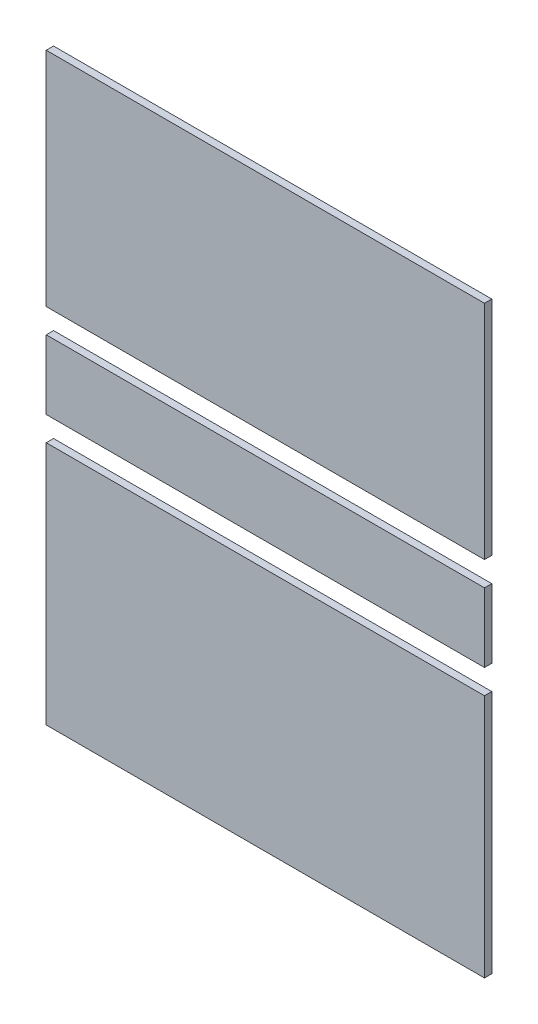
ISO-10303-21;
HEADER;
FILE_DESCRIPTION(('STEP AP214'),'2;1');
FILE_NAME('part.step','',(''),(''),'','','');
FILE_SCHEMA(('AUTOMOTIVE_DESIGN { 1 0 10303 214 1 1 1 1 }'));
ENDSEC;
DATA;
#1=APPLICATION_CONTEXT('core data for automotive mechanical design processes');
#2=APPLICATION_PROTOCOL_DEFINITION('international standard','automotive_design',2000,#1);
#3=PRODUCT_CONTEXT('',#1,'mechanical');
#4=PRODUCT('Part','Part','',(#3));
#5=PRODUCT_RELATED_PRODUCT_CATEGORY('part','',(#4));
#6=PRODUCT_DEFINITION_FORMATION('','',#4);
#7=PRODUCT_DEFINITION_CONTEXT('part definition',#1,'design');
#8=PRODUCT_DEFINITION('design','',#6,#7);
#9=PRODUCT_DEFINITION_SHAPE('','',#8);
#10=(LENGTH_UNIT() NAMED_UNIT(*) SI_UNIT(.MILLI.,.METRE.));
#11=(NAMED_UNIT(*) PLANE_ANGLE_UNIT() SI_UNIT($,.RADIAN.));
#12=(NAMED_UNIT(*) SI_UNIT($,.STERADIAN.) SOLID_ANGLE_UNIT());
#13=UNCERTAINTY_MEASURE_WITH_UNIT(LENGTH_MEASURE(1.E-05),#10,'distance_accuracy_value','');
#14=(GEOMETRIC_REPRESENTATION_CONTEXT(3) GLOBAL_UNCERTAINTY_ASSIGNED_CONTEXT((#13)) GLOBAL_UNIT_ASSIGNED_CONTEXT((#10,
#11,#12)) REPRESENTATION_CONTEXT('',''));
#15=CARTESIAN_POINT('',(0.,0.,0.));
#16=DIRECTION('',(0.,0.,1.));
#17=DIRECTION('',(1.,0.,0.));
#18=AXIS2_PLACEMENT_3D('',#15,#16,#17);
#19=CARTESIAN_POINT('',(0.,235.,-308.556380585461));
#20=DIRECTION('',(-1.,0.,0.));
#21=DIRECTION('',(0.,-1.,0.));
#22=AXIS2_PLACEMENT_3D('',#19,#20,#21);
#23=PLANE('',#22);
#24=DIRECTION('',(0.,1.,0.));
#25=VECTOR('',#24,1.);
#26=CARTESIAN_POINT('',(0.,235.,0.));
#27=LINE('',#26,#25);
#28=CARTESIAN_POINT('',(0.,187.,0.));
#29=VERTEX_POINT('',#28);
#30=CARTESIAN_POINT('',(0.,235.,0.));
#31=VERTEX_POINT('',#30);
#32=EDGE_CURVE('E66',#29,#31,#27,.T.);
#33=ORIENTED_EDGE('',*,*,#32,.F.);
#34=DIRECTION('',(0.,0.,1.));
#35=VECTOR('',#34,1.);
#36=CARTESIAN_POINT('',(0.,187.,-308.556380585461));
#37=LINE('',#36,#35);
#38=CARTESIAN_POINT('',(0.,187.,5.08));
#39=VERTEX_POINT('',#38);
#40=EDGE_CURVE('E94',#29,#39,#37,.T.);
#41=ORIENTED_EDGE('',*,*,#40,.T.);
#42=DIRECTION('',(0.,-1.,0.));
#43=VECTOR('',#42,1.);
#44=CARTESIAN_POINT('',(0.,235.,5.08));
#45=LINE('',#44,#43);
#46=CARTESIAN_POINT('',(0.,235.,5.08));
#47=VERTEX_POINT('',#46);
#48=EDGE_CURVE('E98',#47,#39,#45,.T.);
#49=ORIENTED_EDGE('',*,*,#48,.F.);
#50=DIRECTION('',(0.,0.,1.));
#51=VECTOR('',#50,1.);
#52=CARTESIAN_POINT('',(0.,235.,-308.556380585461));
#53=LINE('',#52,#51);
#54=EDGE_CURVE('E121',#31,#47,#53,.T.);
#55=ORIENTED_EDGE('',*,*,#54,.F.);
#56=EDGE_LOOP('',(#33,#41,#49,#55));
#57=FACE_BOUND('',#56,.T.);
#58=ADVANCED_FACE('F58',(#57),#23,.T.);
#59=CARTESIAN_POINT('',(0.,235.,-308.556380585461));
#60=DIRECTION('',(0.,1.,0.));
#61=DIRECTION('',(0.,0.,1.));
#62=AXIS2_PLACEMENT_3D('',#59,#60,#61);
#63=PLANE('',#62);
#64=DIRECTION('',(1.,0.,0.));
#65=VECTOR('',#64,1.);
#66=CARTESIAN_POINT('',(0.,235.,0.));
#67=LINE('',#66,#65);
#68=CARTESIAN_POINT('',(304.8,235.,0.));
#69=VERTEX_POINT('',#68);
#70=EDGE_CURVE('E72',#31,#69,#67,.T.);
#71=ORIENTED_EDGE('',*,*,#70,.F.);
#72=ORIENTED_EDGE('',*,*,#54,.T.);
#73=DIRECTION('',(-1.,0.,0.));
#74=VECTOR('',#73,1.);
#75=CARTESIAN_POINT('',(0.,235.,5.08));
#76=LINE('',#75,#74);
#77=CARTESIAN_POINT('',(304.8,235.,5.08));
#78=VERTEX_POINT('',#77);
#79=EDGE_CURVE('E103',#78,#47,#76,.T.);
#80=ORIENTED_EDGE('',*,*,#79,.F.);
#81=DIRECTION('',(0.,0.,1.));
#82=VECTOR('',#81,1.);
#83=CARTESIAN_POINT('',(304.8,235.,-308.556380585461));
#84=LINE('',#83,#82);
#85=EDGE_CURVE('E124',#69,#78,#84,.T.);
#86=ORIENTED_EDGE('',*,*,#85,.F.);
#87=EDGE_LOOP('',(#71,#72,#80,#86));
#88=FACE_BOUND('',#87,.T.);
#89=ADVANCED_FACE('F130',(#88),#63,.T.);
#90=CARTESIAN_POINT('',(304.8,235.,-308.556380585461));
#91=DIRECTION('',(1.,0.,0.));
#92=DIRECTION('',(0.,0.,-1.));
#93=AXIS2_PLACEMENT_3D('',#90,#91,#92);
#94=PLANE('',#93);
#95=DIRECTION('',(0.,-1.,0.));
#96=VECTOR('',#95,1.);
#97=CARTESIAN_POINT('',(304.8,235.,0.));
#98=LINE('',#97,#96);
#99=CARTESIAN_POINT('',(304.8,187.,0.));
#100=VERTEX_POINT('',#99);
#101=EDGE_CURVE('E123',#69,#100,#98,.T.);
#102=ORIENTED_EDGE('',*,*,#101,.F.);
#103=ORIENTED_EDGE('',*,*,#85,.T.);
#104=DIRECTION('',(0.,1.,0.));
#105=VECTOR('',#104,1.);
#106=CARTESIAN_POINT('',(304.8,235.,5.08));
#107=LINE('',#106,#105);
#108=CARTESIAN_POINT('',(304.8,187.,5.08));
#109=VERTEX_POINT('',#108);
#110=EDGE_CURVE('E111',#109,#78,#107,.T.);
#111=ORIENTED_EDGE('',*,*,#110,.F.);
#112=DIRECTION('',(0.,0.,1.));
#113=VECTOR('',#112,1.);
#114=CARTESIAN_POINT('',(304.8,187.,-308.556380585461));
#115=LINE('',#114,#113);
#116=EDGE_CURVE('E102',#100,#109,#115,.T.);
#117=ORIENTED_EDGE('',*,*,#116,.F.);
#118=EDGE_LOOP('',(#102,#103,#111,#117));
#119=FACE_BOUND('',#118,.T.);
#120=ADVANCED_FACE('F128',(#119),#94,.T.);
#121=CARTESIAN_POINT('',(0.,187.,-308.556380585461));
#122=DIRECTION('',(0.,-1.,0.));
#123=DIRECTION('',(0.,0.,-1.));
#124=AXIS2_PLACEMENT_3D('',#121,#122,#123);
#125=PLANE('',#124);
#126=DIRECTION('',(-1.,0.,0.));
#127=VECTOR('',#126,1.);
#128=CARTESIAN_POINT('',(0.,187.,0.));
#129=LINE('',#128,#127);
#130=EDGE_CURVE('E12',#100,#29,#129,.T.);
#131=ORIENTED_EDGE('',*,*,#130,.F.);
#132=ORIENTED_EDGE('',*,*,#116,.T.);
#133=DIRECTION('',(1.,0.,0.));
#134=VECTOR('',#133,1.);
#135=CARTESIAN_POINT('',(0.,187.,5.08));
#136=LINE('',#135,#134);
#137=EDGE_CURVE('E105',#39,#109,#136,.T.);
#138=ORIENTED_EDGE('',*,*,#137,.F.);
#139=ORIENTED_EDGE('',*,*,#40,.F.);
#140=EDGE_LOOP('',(#131,#132,#138,#139));
#141=FACE_BOUND('',#140,.T.);
#142=ADVANCED_FACE('F106',(#141),#125,.T.);
#143=CARTESIAN_POINT('',(0.,0.,5.08));
#144=DIRECTION('',(0.,0.,1.));
#145=DIRECTION('',(1.,0.,0.));
#146=AXIS2_PLACEMENT_3D('',#143,#144,#145);
#147=PLANE('',#146);
#148=ORIENTED_EDGE('',*,*,#48,.T.);
#149=ORIENTED_EDGE('',*,*,#137,.T.);
#150=ORIENTED_EDGE('',*,*,#110,.T.);
#151=ORIENTED_EDGE('',*,*,#79,.T.);
#152=EDGE_LOOP('',(#148,#149,#150,#151));
#153=FACE_BOUND('',#152,.T.);
#154=ADVANCED_FACE('F113',(#153),#147,.T.);
#155=CARTESIAN_POINT('',(0.,0.,0.));
#156=DIRECTION('',(0.,0.,1.));
#157=DIRECTION('',(1.,0.,0.));
#158=AXIS2_PLACEMENT_3D('',#155,#156,#157);
#159=PLANE('',#158);
#160=ORIENTED_EDGE('',*,*,#32,.T.);
#161=ORIENTED_EDGE('',*,*,#70,.T.);
#162=ORIENTED_EDGE('',*,*,#101,.T.);
#163=ORIENTED_EDGE('',*,*,#130,.T.);
#164=EDGE_LOOP('',(#160,#161,#162,#163));
#165=FACE_BOUND('',#164,.T.);
#166=ADVANCED_FACE('F132',(#165),#159,.F.);
#167=CLOSED_SHELL('',(#58,#89,#120,#142,#154,#166));
#168=MANIFOLD_SOLID_BREP('B2',#167);
#169=CARTESIAN_POINT('',(0.,170.,5.08));
#170=DIRECTION('',(0.,1.,0.));
#171=DIRECTION('',(0.,0.,1.));
#172=AXIS2_PLACEMENT_3D('',#169,#170,#171);
#173=PLANE('',#172);
#174=DIRECTION('',(1.,0.,0.));
#175=VECTOR('',#174,1.);
#176=CARTESIAN_POINT('',(0.,170.,0.));
#177=LINE('',#176,#175);
#178=CARTESIAN_POINT('',(0.,170.,0.));
#179=VERTEX_POINT('',#178);
#180=CARTESIAN_POINT('',(304.8,170.,0.));
#181=VERTEX_POINT('',#180);
#182=EDGE_CURVE('E274',#179,#181,#177,.T.);
#183=ORIENTED_EDGE('',*,*,#182,.F.);
#184=DIRECTION('',(0.,0.,-1.));
#185=VECTOR('',#184,1.);
#186=CARTESIAN_POINT('',(0.,170.,5.08));
#187=LINE('',#186,#185);
#188=CARTESIAN_POINT('',(0.,170.,5.08));
#189=VERTEX_POINT('',#188);
#190=EDGE_CURVE('E56',#189,#179,#187,.T.);
#191=ORIENTED_EDGE('',*,*,#190,.F.);
#192=DIRECTION('',(1.,0.,0.));
#193=VECTOR('',#192,1.);
#194=CARTESIAN_POINT('',(0.,170.,5.08));
#195=LINE('',#194,#193);
#196=CARTESIAN_POINT('',(304.8,170.,5.08));
#197=VERTEX_POINT('',#196);
#198=EDGE_CURVE('E265',#189,#197,#195,.T.);
#199=ORIENTED_EDGE('',*,*,#198,.T.);
#200=DIRECTION('',(0.,0.,-1.));
#201=VECTOR('',#200,1.);
#202=CARTESIAN_POINT('',(304.8,170.,5.08));
#203=LINE('',#202,#201);
#204=EDGE_CURVE('E244',#197,#181,#203,.T.);
#205=ORIENTED_EDGE('',*,*,#204,.T.);
#206=EDGE_LOOP('',(#183,#191,#199,#205));
#207=FACE_BOUND('',#206,.T.);
#208=ADVANCED_FACE('F205',(#207),#173,.T.);
#209=CARTESIAN_POINT('',(0.,0.,5.08));
#210=DIRECTION('',(-1.,0.,0.));
#211=DIRECTION('',(0.,0.,1.));
#212=AXIS2_PLACEMENT_3D('',#209,#210,#211);
#213=PLANE('',#212);
#214=DIRECTION('',(0.,1.,0.));
#215=VECTOR('',#214,1.);
#216=CARTESIAN_POINT('',(0.,0.,0.));
#217=LINE('',#216,#215);
#218=CARTESIAN_POINT('',(0.,0.,0.));
#219=VERTEX_POINT('',#218);
#220=EDGE_CURVE('E257',#219,#179,#217,.T.);
#221=ORIENTED_EDGE('',*,*,#220,.F.);
#222=DIRECTION('',(0.,0.,-1.));
#223=VECTOR('',#222,1.);
#224=CARTESIAN_POINT('',(0.,0.,5.08));
#225=LINE('',#224,#223);
#226=CARTESIAN_POINT('',(0.,0.,5.08));
#227=VERTEX_POINT('',#226);
#228=EDGE_CURVE('E214',#227,#219,#225,.T.);
#229=ORIENTED_EDGE('',*,*,#228,.F.);
#230=DIRECTION('',(0.,1.,0.));
#231=VECTOR('',#230,1.);
#232=CARTESIAN_POINT('',(0.,0.,5.08));
#233=LINE('',#232,#231);
#234=EDGE_CURVE('E255',#227,#189,#233,.T.);
#235=ORIENTED_EDGE('',*,*,#234,.T.);
#236=ORIENTED_EDGE('',*,*,#190,.T.);
#237=EDGE_LOOP('',(#221,#229,#235,#236));
#238=FACE_BOUND('',#237,.T.);
#239=ADVANCED_FACE('F253',(#238),#213,.T.);
#240=CARTESIAN_POINT('',(0.,0.,5.08));
#241=DIRECTION('',(0.,1.,0.));
#242=DIRECTION('',(0.,0.,1.));
#243=AXIS2_PLACEMENT_3D('',#240,#241,#242);
#244=PLANE('',#243);
#245=DIRECTION('',(1.,0.,0.));
#246=VECTOR('',#245,1.);
#247=CARTESIAN_POINT('',(0.,0.,0.));
#248=LINE('',#247,#246);
#249=CARTESIAN_POINT('',(304.8,0.,0.));
#250=VERTEX_POINT('',#249);
#251=EDGE_CURVE('E237',#219,#250,#248,.T.);
#252=ORIENTED_EDGE('',*,*,#251,.T.);
#253=DIRECTION('',(0.,0.,-1.));
#254=VECTOR('',#253,1.);
#255=CARTESIAN_POINT('',(304.8,0.,5.08));
#256=LINE('',#255,#254);
#257=CARTESIAN_POINT('',(304.8,0.,5.08));
#258=VERTEX_POINT('',#257);
#259=EDGE_CURVE('E259',#258,#250,#256,.T.);
#260=ORIENTED_EDGE('',*,*,#259,.F.);
#261=DIRECTION('',(1.,0.,0.));
#262=VECTOR('',#261,1.);
#263=CARTESIAN_POINT('',(0.,0.,5.08));
#264=LINE('',#263,#262);
#265=EDGE_CURVE('E260',#227,#258,#264,.T.);
#266=ORIENTED_EDGE('',*,*,#265,.F.);
#267=ORIENTED_EDGE('',*,*,#228,.T.);
#268=EDGE_LOOP('',(#252,#260,#266,#267));
#269=FACE_BOUND('',#268,.T.);
#270=ADVANCED_FACE('F261',(#269),#244,.F.);
#271=CARTESIAN_POINT('',(304.8,0.,5.08));
#272=DIRECTION('',(-1.,0.,0.));
#273=DIRECTION('',(0.,0.,1.));
#274=AXIS2_PLACEMENT_3D('',#271,#272,#273);
#275=PLANE('',#274);
#276=DIRECTION('',(0.,1.,0.));
#277=VECTOR('',#276,1.);
#278=CARTESIAN_POINT('',(304.8,0.,0.));
#279=LINE('',#278,#277);
#280=EDGE_CURVE('E269',#250,#181,#279,.T.);
#281=ORIENTED_EDGE('',*,*,#280,.T.);
#282=ORIENTED_EDGE('',*,*,#204,.F.);
#283=DIRECTION('',(0.,1.,0.));
#284=VECTOR('',#283,1.);
#285=CARTESIAN_POINT('',(304.8,0.,5.08));
#286=LINE('',#285,#284);
#287=EDGE_CURVE('E222',#258,#197,#286,.T.);
#288=ORIENTED_EDGE('',*,*,#287,.F.);
#289=ORIENTED_EDGE('',*,*,#259,.T.);
#290=EDGE_LOOP('',(#281,#282,#288,#289));
#291=FACE_BOUND('',#290,.T.);
#292=ADVANCED_FACE('F289',(#291),#275,.F.);
#293=CARTESIAN_POINT('',(0.,0.,5.08));
#294=DIRECTION('',(0.,0.,1.));
#295=DIRECTION('',(1.,0.,0.));
#296=AXIS2_PLACEMENT_3D('',#293,#294,#295);
#297=PLANE('',#296);
#298=ORIENTED_EDGE('',*,*,#198,.F.);
#299=ORIENTED_EDGE('',*,*,#234,.F.);
#300=ORIENTED_EDGE('',*,*,#265,.T.);
#301=ORIENTED_EDGE('',*,*,#287,.T.);
#302=EDGE_LOOP('',(#298,#299,#300,#301));
#303=FACE_BOUND('',#302,.T.);
#304=ADVANCED_FACE('F264',(#303),#297,.T.);
#305=CARTESIAN_POINT('',(0.,0.,0.));
#306=DIRECTION('',(0.,0.,1.));
#307=DIRECTION('',(1.,0.,0.));
#308=AXIS2_PLACEMENT_3D('',#305,#306,#307);
#309=PLANE('',#308);
#310=ORIENTED_EDGE('',*,*,#182,.T.);
#311=ORIENTED_EDGE('',*,*,#280,.F.);
#312=ORIENTED_EDGE('',*,*,#251,.F.);
#313=ORIENTED_EDGE('',*,*,#220,.T.);
#314=EDGE_LOOP('',(#310,#311,#312,#313));
#315=FACE_BOUND('',#314,.T.);
#316=ADVANCED_FACE('F291',(#315),#309,.F.);
#317=CLOSED_SHELL('',(#208,#239,#270,#292,#304,#316));
#318=MANIFOLD_SOLID_BREP('B6',#317);
#319=CARTESIAN_POINT('',(0.,0.,5.08));
#320=DIRECTION('',(-1.,0.,0.));
#321=DIRECTION('',(0.,0.,1.));
#322=AXIS2_PLACEMENT_3D('',#319,#320,#321);
#323=PLANE('',#322);
#324=DIRECTION('',(0.,1.,0.));
#325=VECTOR('',#324,1.);
#326=CARTESIAN_POINT('',(0.,0.,0.));
#327=LINE('',#326,#325);
#328=CARTESIAN_POINT('',(0.,252.,0.));
#329=VERTEX_POINT('',#328);
#330=CARTESIAN_POINT('',(0.,406.4,0.));
#331=VERTEX_POINT('',#330);
#332=EDGE_CURVE('E428',#329,#331,#327,.T.);
#333=ORIENTED_EDGE('',*,*,#332,.F.);
#334=DIRECTION('',(0.,0.,-1.));
#335=VECTOR('',#334,1.);
#336=CARTESIAN_POINT('',(0.,252.,5.08));
#337=LINE('',#336,#335);
#338=CARTESIAN_POINT('',(0.,252.,5.08));
#339=VERTEX_POINT('',#338);
#340=EDGE_CURVE('E203',#339,#329,#337,.T.);
#341=ORIENTED_EDGE('',*,*,#340,.F.);
#342=DIRECTION('',(0.,1.,0.));
#343=VECTOR('',#342,1.);
#344=CARTESIAN_POINT('',(0.,0.,5.08));
#345=LINE('',#344,#343);
#346=CARTESIAN_POINT('',(0.,406.4,5.08));
#347=VERTEX_POINT('',#346);
#348=EDGE_CURVE('E413',#339,#347,#345,.T.);
#349=ORIENTED_EDGE('',*,*,#348,.T.);
#350=DIRECTION('',(0.,0.,-1.));
#351=VECTOR('',#350,1.);
#352=CARTESIAN_POINT('',(0.,406.4,5.08));
#353=LINE('',#352,#351);
#354=EDGE_CURVE('E381',#347,#331,#353,.T.);
#355=ORIENTED_EDGE('',*,*,#354,.T.);
#356=EDGE_LOOP('',(#333,#341,#349,#355));
#357=FACE_BOUND('',#356,.T.);
#358=ADVANCED_FACE('F365',(#357),#323,.T.);
#359=CARTESIAN_POINT('',(0.,252.,5.08));
#360=DIRECTION('',(0.,1.,0.));
#361=DIRECTION('',(0.,0.,1.));
#362=AXIS2_PLACEMENT_3D('',#359,#360,#361);
#363=PLANE('',#362);
#364=DIRECTION('',(1.,0.,0.));
#365=VECTOR('',#364,1.);
#366=CARTESIAN_POINT('',(0.,252.,0.));
#367=LINE('',#366,#365);
#368=CARTESIAN_POINT('',(304.8,252.,0.));
#369=VERTEX_POINT('',#368);
#370=EDGE_CURVE('E419',#329,#369,#367,.T.);
#371=ORIENTED_EDGE('',*,*,#370,.T.);
#372=DIRECTION('',(0.,0.,-1.));
#373=VECTOR('',#372,1.);
#374=CARTESIAN_POINT('',(304.8,252.,5.08));
#375=LINE('',#374,#373);
#376=CARTESIAN_POINT('',(304.8,252.,5.08));
#377=VERTEX_POINT('',#376);
#378=EDGE_CURVE('E373',#377,#369,#375,.T.);
#379=ORIENTED_EDGE('',*,*,#378,.F.);
#380=DIRECTION('',(1.,0.,0.));
#381=VECTOR('',#380,1.);
#382=CARTESIAN_POINT('',(0.,252.,5.08));
#383=LINE('',#382,#381);
#384=EDGE_CURVE('E407',#339,#377,#383,.T.);
#385=ORIENTED_EDGE('',*,*,#384,.F.);
#386=ORIENTED_EDGE('',*,*,#340,.T.);
#387=EDGE_LOOP('',(#371,#379,#385,#386));
#388=FACE_BOUND('',#387,.T.);
#389=ADVANCED_FACE('F417',(#388),#363,.F.);
#390=CARTESIAN_POINT('',(304.8,0.,5.08));
#391=DIRECTION('',(-1.,0.,0.));
#392=DIRECTION('',(0.,0.,1.));
#393=AXIS2_PLACEMENT_3D('',#390,#391,#392);
#394=PLANE('',#393);
#395=DIRECTION('',(0.,1.,0.));
#396=VECTOR('',#395,1.);
#397=CARTESIAN_POINT('',(304.8,0.,0.));
#398=LINE('',#397,#396);
#399=CARTESIAN_POINT('',(304.8,406.4,0.));
#400=VERTEX_POINT('',#399);
#401=EDGE_CURVE('E431',#369,#400,#398,.T.);
#402=ORIENTED_EDGE('',*,*,#401,.T.);
#403=DIRECTION('',(0.,0.,-1.));
#404=VECTOR('',#403,1.);
#405=CARTESIAN_POINT('',(304.8,406.4,5.08));
#406=LINE('',#405,#404);
#407=CARTESIAN_POINT('',(304.8,406.4,5.08));
#408=VERTEX_POINT('',#407);
#409=EDGE_CURVE('E395',#408,#400,#406,.T.);
#410=ORIENTED_EDGE('',*,*,#409,.F.);
#411=DIRECTION('',(0.,1.,0.));
#412=VECTOR('',#411,1.);
#413=CARTESIAN_POINT('',(304.8,0.,5.08));
#414=LINE('',#413,#412);
#415=EDGE_CURVE('E412',#377,#408,#414,.T.);
#416=ORIENTED_EDGE('',*,*,#415,.F.);
#417=ORIENTED_EDGE('',*,*,#378,.T.);
#418=EDGE_LOOP('',(#402,#410,#416,#417));
#419=FACE_BOUND('',#418,.T.);
#420=ADVANCED_FACE('F422',(#419),#394,.F.);
#421=CARTESIAN_POINT('',(0.,406.4,5.08));
#422=DIRECTION('',(0.,1.,0.));
#423=DIRECTION('',(0.,0.,1.));
#424=AXIS2_PLACEMENT_3D('',#421,#422,#423);
#425=PLANE('',#424);
#426=DIRECTION('',(1.,0.,0.));
#427=VECTOR('',#426,1.);
#428=CARTESIAN_POINT('',(0.,406.4,0.));
#429=LINE('',#428,#427);
#430=EDGE_CURVE('E433',#331,#400,#429,.T.);
#431=ORIENTED_EDGE('',*,*,#430,.F.);
#432=ORIENTED_EDGE('',*,*,#354,.F.);
#433=DIRECTION('',(1.,0.,0.));
#434=VECTOR('',#433,1.);
#435=CARTESIAN_POINT('',(0.,406.4,5.08));
#436=LINE('',#435,#434);
#437=EDGE_CURVE('E423',#347,#408,#436,.T.);
#438=ORIENTED_EDGE('',*,*,#437,.T.);
#439=ORIENTED_EDGE('',*,*,#409,.T.);
#440=EDGE_LOOP('',(#431,#432,#438,#439));
#441=FACE_BOUND('',#440,.T.);
#442=ADVANCED_FACE('F438',(#441),#425,.T.);
#443=CARTESIAN_POINT('',(0.,0.,5.08));
#444=DIRECTION('',(0.,0.,1.));
#445=DIRECTION('',(1.,0.,0.));
#446=AXIS2_PLACEMENT_3D('',#443,#444,#445);
#447=PLANE('',#446);
#448=ORIENTED_EDGE('',*,*,#348,.F.);
#449=ORIENTED_EDGE('',*,*,#384,.T.);
#450=ORIENTED_EDGE('',*,*,#415,.T.);
#451=ORIENTED_EDGE('',*,*,#437,.F.);
#452=EDGE_LOOP('',(#448,#449,#450,#451));
#453=FACE_BOUND('',#452,.T.);
#454=ADVANCED_FACE('F409',(#453),#447,.T.);
#455=CARTESIAN_POINT('',(0.,0.,0.));
#456=DIRECTION('',(0.,0.,1.));
#457=DIRECTION('',(1.,0.,0.));
#458=AXIS2_PLACEMENT_3D('',#455,#456,#457);
#459=PLANE('',#458);
#460=ORIENTED_EDGE('',*,*,#332,.T.);
#461=ORIENTED_EDGE('',*,*,#430,.T.);
#462=ORIENTED_EDGE('',*,*,#401,.F.);
#463=ORIENTED_EDGE('',*,*,#370,.F.);
#464=EDGE_LOOP('',(#460,#461,#462,#463));
#465=FACE_BOUND('',#464,.T.);
#466=ADVANCED_FACE('F445',(#465),#459,.F.);
#467=CLOSED_SHELL('',(#358,#389,#420,#442,#454,#466));
#468=MANIFOLD_SOLID_BREP('B50',#467);
#469=ADVANCED_BREP_SHAPE_REPRESENTATION('',(#18,#168,#318,#468),#14);
#470=SHAPE_DEFINITION_REPRESENTATION(#9,#469);
ENDSEC;
END-ISO-10303-21;
